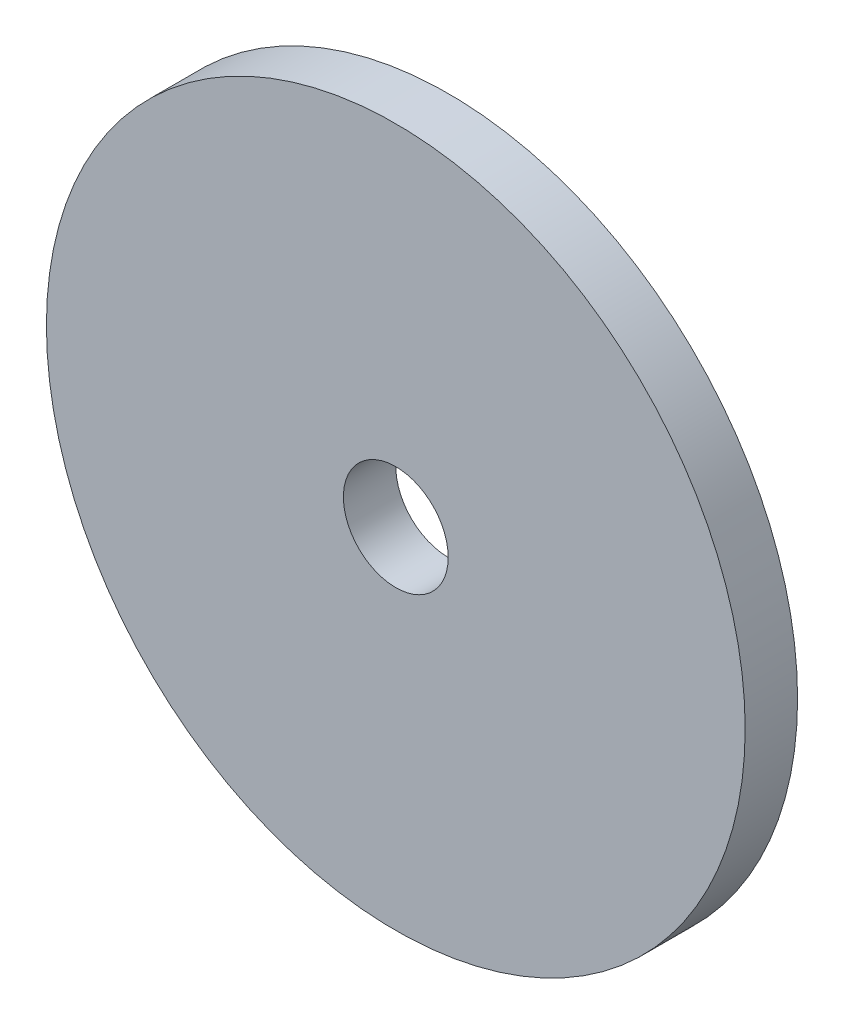
ISO-10303-21;
HEADER;
FILE_DESCRIPTION(('STEP AP214'),'2;1');
FILE_NAME('part.step','',(''),(''),'','','');
FILE_SCHEMA(('AUTOMOTIVE_DESIGN { 1 0 10303 214 1 1 1 1 }'));
ENDSEC;
DATA;
#1=APPLICATION_CONTEXT('core data for automotive mechanical design processes');
#2=APPLICATION_PROTOCOL_DEFINITION('international standard','automotive_design',2000,#1);
#3=PRODUCT_CONTEXT('',#1,'mechanical');
#4=PRODUCT('Part','Part','',(#3));
#5=PRODUCT_RELATED_PRODUCT_CATEGORY('part','',(#4));
#6=PRODUCT_DEFINITION_FORMATION('','',#4);
#7=PRODUCT_DEFINITION_CONTEXT('part definition',#1,'design');
#8=PRODUCT_DEFINITION('design','',#6,#7);
#9=PRODUCT_DEFINITION_SHAPE('','',#8);
#10=(LENGTH_UNIT() NAMED_UNIT(*) SI_UNIT(.MILLI.,.METRE.));
#11=(NAMED_UNIT(*) PLANE_ANGLE_UNIT() SI_UNIT($,.RADIAN.));
#12=(NAMED_UNIT(*) SI_UNIT($,.STERADIAN.) SOLID_ANGLE_UNIT());
#13=UNCERTAINTY_MEASURE_WITH_UNIT(LENGTH_MEASURE(1.E-05),#10,'distance_accuracy_value','');
#14=(GEOMETRIC_REPRESENTATION_CONTEXT(3) GLOBAL_UNCERTAINTY_ASSIGNED_CONTEXT((#13)) GLOBAL_UNIT_ASSIGNED_CONTEXT((#10,
#11,#12)) REPRESENTATION_CONTEXT('',''));
#15=CARTESIAN_POINT('',(0.,0.,0.));
#16=DIRECTION('',(0.,0.,1.));
#17=DIRECTION('',(1.,0.,0.));
#18=AXIS2_PLACEMENT_3D('',#15,#16,#17);
#19=CARTESIAN_POINT('',(0.,0.,6.));
#20=DIRECTION('',(0.,0.,-1.));
#21=DIRECTION('',(-1.,0.,0.));
#22=AXIS2_PLACEMENT_3D('',#19,#20,#21);
#23=CYLINDRICAL_SURFACE('',#22,6.);
#24=CARTESIAN_POINT('',(0.,0.,6.));
#25=DIRECTION('',(0.,0.,1.));
#26=DIRECTION('',(1.,0.,0.));
#27=AXIS2_PLACEMENT_3D('',#24,#25,#26);
#28=CIRCLE('',#27,6.);
#29=CARTESIAN_POINT('',(6.,0.,6.));
#30=VERTEX_POINT('',#29);
#31=EDGE_CURVE('E42',#30,#30,#28,.T.);
#32=ORIENTED_EDGE('',*,*,#31,.T.);
#33=EDGE_LOOP('',(#32));
#34=FACE_BOUND('',#33,.T.);
#35=CARTESIAN_POINT('',(0.,0.,0.));
#36=DIRECTION('',(0.,0.,1.));
#37=DIRECTION('',(1.,0.,0.));
#38=AXIS2_PLACEMENT_3D('',#35,#36,#37);
#39=CIRCLE('',#38,6.);
#40=CARTESIAN_POINT('',(6.,0.,0.));
#41=VERTEX_POINT('',#40);
#42=EDGE_CURVE('E48',#41,#41,#39,.T.);
#43=ORIENTED_EDGE('',*,*,#42,.F.);
#44=EDGE_LOOP('',(#43));
#45=FACE_BOUND('',#44,.T.);
#46=ADVANCED_FACE('F35',(#34,#45),#23,.F.);
#47=CARTESIAN_POINT('',(0.,0.,6.));
#48=DIRECTION('',(0.,0.,-1.));
#49=DIRECTION('',(-1.,0.,0.));
#50=AXIS2_PLACEMENT_3D('',#47,#48,#49);
#51=CYLINDRICAL_SURFACE('',#50,40.);
#52=CARTESIAN_POINT('',(0.,0.,6.));
#53=DIRECTION('',(0.,0.,1.));
#54=DIRECTION('',(1.,0.,0.));
#55=AXIS2_PLACEMENT_3D('',#52,#53,#54);
#56=CIRCLE('',#55,40.);
#57=CARTESIAN_POINT('',(40.,0.,6.));
#58=VERTEX_POINT('',#57);
#59=EDGE_CURVE('E10',#58,#58,#56,.T.);
#60=ORIENTED_EDGE('',*,*,#59,.F.);
#61=EDGE_LOOP('',(#60));
#62=FACE_BOUND('',#61,.T.);
#63=CARTESIAN_POINT('',(0.,0.,0.));
#64=DIRECTION('',(0.,0.,1.));
#65=DIRECTION('',(1.,0.,0.));
#66=AXIS2_PLACEMENT_3D('',#63,#64,#65);
#67=CIRCLE('',#66,40.);
#68=CARTESIAN_POINT('',(40.,0.,0.));
#69=VERTEX_POINT('',#68);
#70=EDGE_CURVE('E38',#69,#69,#67,.T.);
#71=ORIENTED_EDGE('',*,*,#70,.T.);
#72=EDGE_LOOP('',(#71));
#73=FACE_BOUND('',#72,.T.);
#74=ADVANCED_FACE('F55',(#62,#73),#51,.T.);
#75=CARTESIAN_POINT('',(0.,0.,6.));
#76=DIRECTION('',(0.,0.,1.));
#77=DIRECTION('',(1.,0.,0.));
#78=AXIS2_PLACEMENT_3D('',#75,#76,#77);
#79=PLANE('',#78);
#80=ORIENTED_EDGE('',*,*,#31,.F.);
#81=EDGE_LOOP('',(#80));
#82=FACE_BOUND('',#81,.T.);
#83=ORIENTED_EDGE('',*,*,#59,.T.);
#84=EDGE_LOOP('',(#83));
#85=FACE_BOUND('',#84,.T.);
#86=ADVANCED_FACE('F59',(#82,#85),#79,.T.);
#87=CARTESIAN_POINT('',(0.,0.,0.));
#88=DIRECTION('',(0.,0.,1.));
#89=DIRECTION('',(1.,0.,0.));
#90=AXIS2_PLACEMENT_3D('',#87,#88,#89);
#91=PLANE('',#90);
#92=ORIENTED_EDGE('',*,*,#42,.T.);
#93=EDGE_LOOP('',(#92));
#94=FACE_BOUND('',#93,.T.);
#95=ORIENTED_EDGE('',*,*,#70,.F.);
#96=EDGE_LOOP('',(#95));
#97=FACE_BOUND('',#96,.T.);
#98=ADVANCED_FACE('F57',(#94,#97),#91,.F.);
#99=CLOSED_SHELL('',(#46,#74,#86,#98));
#100=MANIFOLD_SOLID_BREP('B2',#99);
#101=ADVANCED_BREP_SHAPE_REPRESENTATION('',(#18,#100),#14);
#102=SHAPE_DEFINITION_REPRESENTATION(#9,#101);
ENDSEC;
END-ISO-10303-21;
